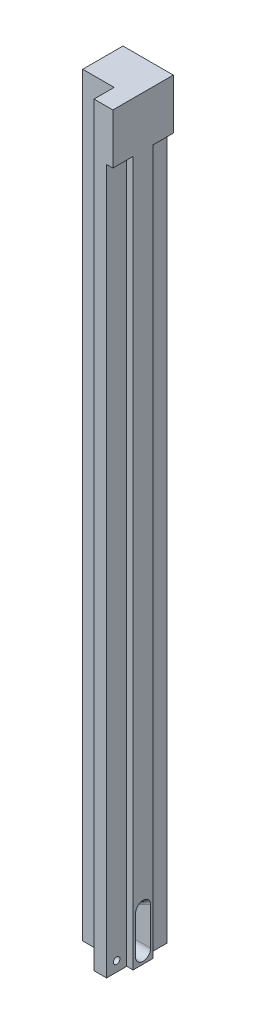
ISO-10303-21;
HEADER;
FILE_DESCRIPTION(('STEP AP214'),'2;1');
FILE_NAME('part.step','',(''),(''),'','','');
FILE_SCHEMA(('AUTOMOTIVE_DESIGN { 1 0 10303 214 1 1 1 1 }'));
ENDSEC;
DATA;
#1=APPLICATION_CONTEXT('core data for automotive mechanical design processes');
#2=APPLICATION_PROTOCOL_DEFINITION('international standard','automotive_design',2000,#1);
#3=PRODUCT_CONTEXT('',#1,'mechanical');
#4=PRODUCT('Part','Part','',(#3));
#5=PRODUCT_RELATED_PRODUCT_CATEGORY('part','',(#4));
#6=PRODUCT_DEFINITION_FORMATION('','',#4);
#7=PRODUCT_DEFINITION_CONTEXT('part definition',#1,'design');
#8=PRODUCT_DEFINITION('design','',#6,#7);
#9=PRODUCT_DEFINITION_SHAPE('','',#8);
#10=(LENGTH_UNIT() NAMED_UNIT(*) SI_UNIT(.MILLI.,.METRE.));
#11=(NAMED_UNIT(*) PLANE_ANGLE_UNIT() SI_UNIT($,.RADIAN.));
#12=(NAMED_UNIT(*) SI_UNIT($,.STERADIAN.) SOLID_ANGLE_UNIT());
#13=UNCERTAINTY_MEASURE_WITH_UNIT(LENGTH_MEASURE(1.E-05),#10,'distance_accuracy_value','');
#14=(GEOMETRIC_REPRESENTATION_CONTEXT(3) GLOBAL_UNCERTAINTY_ASSIGNED_CONTEXT((#13)) GLOBAL_UNIT_ASSIGNED_CONTEXT((#10,
#11,#12)) REPRESENTATION_CONTEXT('',''));
#15=CARTESIAN_POINT('',(0.,0.,0.));
#16=DIRECTION('',(0.,0.,1.));
#17=DIRECTION('',(1.,0.,0.));
#18=AXIS2_PLACEMENT_3D('',#15,#16,#17);
#19=CARTESIAN_POINT('',(0.,0.,0.));
#20=DIRECTION('',(0.,0.,1.));
#21=DIRECTION('',(1.,0.,0.));
#22=AXIS2_PLACEMENT_3D('',#19,#20,#21);
#23=PLANE('',#22);
#24=DIRECTION('',(1.,0.,0.));
#25=VECTOR('',#24,1.);
#26=CARTESIAN_POINT('',(6.34999999999999,82.55,0.));
#27=LINE('',#26,#25);
#28=CARTESIAN_POINT('',(4.76250000000001,82.55,0.));
#29=VERTEX_POINT('',#28);
#30=CARTESIAN_POINT('',(6.34999999999999,82.55,0.));
#31=VERTEX_POINT('',#30);
#32=EDGE_CURVE('E256',#29,#31,#27,.T.);
#33=ORIENTED_EDGE('',*,*,#32,.T.);
#34=DIRECTION('',(0.,1.,0.));
#35=VECTOR('',#34,1.);
#36=CARTESIAN_POINT('',(6.34999999999999,95.25,0.));
#37=LINE('',#36,#35);
#38=CARTESIAN_POINT('',(6.35000000000001,-95.25,0.));
#39=VERTEX_POINT('',#38);
#40=EDGE_CURVE('E455',#39,#31,#37,.T.);
#41=ORIENTED_EDGE('',*,*,#40,.F.);
#42=DIRECTION('',(1.,0.,0.));
#43=VECTOR('',#42,1.);
#44=CARTESIAN_POINT('',(-6.34999999999999,-95.25,0.));
#45=LINE('',#44,#43);
#46=CARTESIAN_POINT('',(4.76250000000001,-95.25,0.));
#47=VERTEX_POINT('',#46);
#48=EDGE_CURVE('E443',#47,#39,#45,.T.);
#49=ORIENTED_EDGE('',*,*,#48,.F.);
#50=DIRECTION('',(0.,-1.,0.));
#51=VECTOR('',#50,1.);
#52=CARTESIAN_POINT('',(4.76250000000001,95.25,0.));
#53=LINE('',#52,#51);
#54=EDGE_CURVE('E270',#29,#47,#53,.T.);
#55=ORIENTED_EDGE('',*,*,#54,.F.);
#56=EDGE_LOOP('',(#33,#41,#49,#55));
#57=FACE_BOUND('',#56,.T.);
#58=ADVANCED_FACE('F90',(#57),#23,.F.);
#59=CARTESIAN_POINT('',(4.76250000000001,95.25,0.));
#60=DIRECTION('',(1.,0.,0.));
#61=DIRECTION('',(0.,0.,-1.));
#62=AXIS2_PLACEMENT_3D('',#59,#60,#61);
#63=PLANE('',#62);
#64=DIRECTION('',(0.,-1.,0.));
#65=VECTOR('',#64,1.);
#66=CARTESIAN_POINT('',(4.76250000000001,95.25,-5.08));
#67=LINE('',#66,#65);
#68=CARTESIAN_POINT('',(4.76250000000001,82.55,-5.08));
#69=VERTEX_POINT('',#68);
#70=CARTESIAN_POINT('',(4.76250000000001,-95.25,-5.08));
#71=VERTEX_POINT('',#70);
#72=EDGE_CURVE('E276',#69,#71,#67,.T.);
#73=ORIENTED_EDGE('',*,*,#72,.F.);
#74=DIRECTION('',(0.,0.,1.));
#75=VECTOR('',#74,1.);
#76=CARTESIAN_POINT('',(4.76250000000001,82.55,0.));
#77=LINE('',#76,#75);
#78=EDGE_CURVE('E252',#69,#29,#77,.T.);
#79=ORIENTED_EDGE('',*,*,#78,.T.);
#80=ORIENTED_EDGE('',*,*,#54,.T.);
#81=DIRECTION('',(0.,0.,1.));
#82=VECTOR('',#81,1.);
#83=CARTESIAN_POINT('',(4.76250000000001,-95.25,0.));
#84=LINE('',#83,#82);
#85=EDGE_CURVE('E281',#71,#47,#84,.T.);
#86=ORIENTED_EDGE('',*,*,#85,.F.);
#87=EDGE_LOOP('',(#73,#79,#80,#86));
#88=FACE_BOUND('',#87,.T.);
#89=ADVANCED_FACE('F540',(#88),#63,.T.);
#90=CARTESIAN_POINT('',(0.,0.,5.08));
#91=DIRECTION('',(0.,0.,1.));
#92=DIRECTION('',(1.,0.,0.));
#93=AXIS2_PLACEMENT_3D('',#90,#91,#92);
#94=PLANE('',#93);
#95=DIRECTION('',(-1.,0.,0.));
#96=VECTOR('',#95,1.);
#97=CARTESIAN_POINT('',(6.34999999999999,82.55,5.08));
#98=LINE('',#97,#96);
#99=CARTESIAN_POINT('',(6.34999999999999,82.55,5.08));
#100=VERTEX_POINT('',#99);
#101=CARTESIAN_POINT('',(4.76250000000001,82.55,5.08));
#102=VERTEX_POINT('',#101);
#103=EDGE_CURVE('E240',#100,#102,#98,.T.);
#104=ORIENTED_EDGE('',*,*,#103,.T.);
#105=DIRECTION('',(0.,-1.,0.));
#106=VECTOR('',#105,1.);
#107=CARTESIAN_POINT('',(4.76250000000001,95.25,5.08));
#108=LINE('',#107,#106);
#109=CARTESIAN_POINT('',(4.76250000000001,-95.25,5.08));
#110=VERTEX_POINT('',#109);
#111=EDGE_CURVE('E294',#102,#110,#108,.T.);
#112=ORIENTED_EDGE('',*,*,#111,.T.);
#113=DIRECTION('',(1.,0.,0.));
#114=VECTOR('',#113,1.);
#115=CARTESIAN_POINT('',(-6.34999999999999,-95.25,5.08));
#116=LINE('',#115,#114);
#117=CARTESIAN_POINT('',(6.35000000000001,-95.25,5.08));
#118=VERTEX_POINT('',#117);
#119=EDGE_CURVE('E449',#110,#118,#116,.T.);
#120=ORIENTED_EDGE('',*,*,#119,.T.);
#121=DIRECTION('',(0.,1.,0.));
#122=VECTOR('',#121,1.);
#123=CARTESIAN_POINT('',(6.34999999999999,95.25,5.08));
#124=LINE('',#123,#122);
#125=EDGE_CURVE('E110',#118,#100,#124,.T.);
#126=ORIENTED_EDGE('',*,*,#125,.T.);
#127=EDGE_LOOP('',(#104,#112,#120,#126));
#128=FACE_BOUND('',#127,.T.);
#129=ADVANCED_FACE('F535',(#128),#94,.T.);
#130=CARTESIAN_POINT('',(6.34999999999999,95.25,5.08));
#131=DIRECTION('',(-1.,0.,0.));
#132=DIRECTION('',(0.,-1.,0.));
#133=AXIS2_PLACEMENT_3D('',#130,#131,#132);
#134=PLANE('',#133);
#135=DIRECTION('',(0.,1.,0.));
#136=VECTOR('',#135,1.);
#137=CARTESIAN_POINT('',(6.35000000000001,-92.71,0.635));
#138=LINE('',#137,#136);
#139=CARTESIAN_POINT('',(6.35000000000001,-92.71,0.635));
#140=VERTEX_POINT('',#139);
#141=CARTESIAN_POINT('',(6.35000000000001,-83.185,0.635));
#142=VERTEX_POINT('',#141);
#143=EDGE_CURVE('E329',#140,#142,#138,.T.);
#144=ORIENTED_EDGE('',*,*,#143,.F.);
#145=CARTESIAN_POINT('',(6.35000000000001,-92.71,2.54));
#146=DIRECTION('',(1.,0.,0.));
#147=DIRECTION('',(0.,-1.,0.));
#148=AXIS2_PLACEMENT_3D('',#145,#146,#147);
#149=CIRCLE('',#148,1.905);
#150=CARTESIAN_POINT('',(6.35000000000001,-92.71,4.445));
#151=VERTEX_POINT('',#150);
#152=EDGE_CURVE('E308',#151,#140,#149,.T.);
#153=ORIENTED_EDGE('',*,*,#152,.F.);
#154=DIRECTION('',(0.,-1.,0.));
#155=VECTOR('',#154,1.);
#156=CARTESIAN_POINT('',(6.35000000000001,-92.71,4.445));
#157=LINE('',#156,#155);
#158=CARTESIAN_POINT('',(6.35000000000001,-83.185,4.445));
#159=VERTEX_POINT('',#158);
#160=EDGE_CURVE('E416',#159,#151,#157,.T.);
#161=ORIENTED_EDGE('',*,*,#160,.F.);
#162=CARTESIAN_POINT('',(6.35000000000001,-83.185,2.54));
#163=DIRECTION('',(1.,0.,0.));
#164=DIRECTION('',(0.,-1.,0.));
#165=AXIS2_PLACEMENT_3D('',#162,#163,#164);
#166=CIRCLE('',#165,1.905);
#167=EDGE_CURVE('E95',#142,#159,#166,.T.);
#168=ORIENTED_EDGE('',*,*,#167,.F.);
#169=EDGE_LOOP('',(#144,#153,#161,#168));
#170=FACE_BOUND('',#169,.T.);
#171=ORIENTED_EDGE('',*,*,#40,.T.);
#172=DIRECTION('',(0.,0.,-1.));
#173=VECTOR('',#172,1.);
#174=CARTESIAN_POINT('',(6.34999999999999,82.55,0.));
#175=LINE('',#174,#173);
#176=CARTESIAN_POINT('',(6.34999999999999,82.55,-5.08));
#177=VERTEX_POINT('',#176);
#178=EDGE_CURVE('E246',#31,#177,#175,.T.);
#179=ORIENTED_EDGE('',*,*,#178,.T.);
#180=DIRECTION('',(0.,1.,0.));
#181=VECTOR('',#180,1.);
#182=CARTESIAN_POINT('',(6.34999999999999,82.55,-5.08));
#183=LINE('',#182,#181);
#184=CARTESIAN_POINT('',(6.34999999999999,95.25,-5.08));
#185=VERTEX_POINT('',#184);
#186=EDGE_CURVE('E214',#177,#185,#183,.T.);
#187=ORIENTED_EDGE('',*,*,#186,.T.);
#188=DIRECTION('',(0.,0.,-1.));
#189=VECTOR('',#188,1.);
#190=CARTESIAN_POINT('',(6.34999999999999,95.25,5.08));
#191=LINE('',#190,#189);
#192=CARTESIAN_POINT('',(6.34999999999999,95.25,10.16));
#193=VERTEX_POINT('',#192);
#194=EDGE_CURVE('E12',#193,#185,#191,.T.);
#195=ORIENTED_EDGE('',*,*,#194,.F.);
#196=DIRECTION('',(0.,1.,0.));
#197=VECTOR('',#196,1.);
#198=CARTESIAN_POINT('',(6.34999999999999,82.55,10.16));
#199=LINE('',#198,#197);
#200=CARTESIAN_POINT('',(6.34999999999999,82.55,10.16));
#201=VERTEX_POINT('',#200);
#202=EDGE_CURVE('E211',#201,#193,#199,.T.);
#203=ORIENTED_EDGE('',*,*,#202,.F.);
#204=DIRECTION('',(0.,0.,-1.));
#205=VECTOR('',#204,1.);
#206=CARTESIAN_POINT('',(6.34999999999999,82.55,5.08));
#207=LINE('',#206,#205);
#208=EDGE_CURVE('E243',#201,#100,#207,.T.);
#209=ORIENTED_EDGE('',*,*,#208,.T.);
#210=ORIENTED_EDGE('',*,*,#125,.F.);
#211=DIRECTION('',(0.,0.,-1.));
#212=VECTOR('',#211,1.);
#213=CARTESIAN_POINT('',(6.35000000000001,-95.25,5.08));
#214=LINE('',#213,#212);
#215=EDGE_CURVE('E454',#118,#39,#214,.T.);
#216=ORIENTED_EDGE('',*,*,#215,.T.);
#217=EDGE_LOOP('',(#171,#179,#187,#195,#203,#209,#210,#216));
#218=FACE_BOUND('',#217,.T.);
#219=ADVANCED_FACE('F92',(#170,#218),#134,.F.);
#220=CARTESIAN_POINT('',(-6.35000000000001,95.25,5.08));
#221=DIRECTION('',(0.,-1.,0.));
#222=DIRECTION('',(0.,0.,-1.));
#223=AXIS2_PLACEMENT_3D('',#220,#221,#222);
#224=PLANE('',#223);
#225=ORIENTED_EDGE('',*,*,#194,.T.);
#226=DIRECTION('',(1.,0.,0.));
#227=VECTOR('',#226,1.);
#228=CARTESIAN_POINT('',(-6.34999999999999,95.25,-5.08));
#229=LINE('',#228,#227);
#230=CARTESIAN_POINT('',(-6.34999999999999,95.25,-5.08));
#231=VERTEX_POINT('',#230);
#232=EDGE_CURVE('E275',#231,#185,#229,.T.);
#233=ORIENTED_EDGE('',*,*,#232,.F.);
#234=DIRECTION('',(0.,0.,-1.));
#235=VECTOR('',#234,1.);
#236=CARTESIAN_POINT('',(-6.35000000000001,95.25,5.08));
#237=LINE('',#236,#235);
#238=CARTESIAN_POINT('',(-6.35000000000001,95.25,5.08));
#239=VERTEX_POINT('',#238);
#240=EDGE_CURVE('E102',#239,#231,#237,.T.);
#241=ORIENTED_EDGE('',*,*,#240,.F.);
#242=DIRECTION('',(-1.,0.,0.));
#243=VECTOR('',#242,1.);
#244=CARTESIAN_POINT('',(-6.35000000000001,95.25,5.08));
#245=LINE('',#244,#243);
#246=CARTESIAN_POINT('',(1.58750000000001,95.25,5.08));
#247=VERTEX_POINT('',#246);
#248=EDGE_CURVE('E442',#247,#239,#245,.T.);
#249=ORIENTED_EDGE('',*,*,#248,.F.);
#250=DIRECTION('',(0.,0.,-1.));
#251=VECTOR('',#250,1.);
#252=CARTESIAN_POINT('',(1.58750000000001,95.25,10.16));
#253=LINE('',#252,#251);
#254=CARTESIAN_POINT('',(1.58750000000001,95.25,10.16));
#255=VERTEX_POINT('',#254);
#256=EDGE_CURVE('E223',#255,#247,#253,.T.);
#257=ORIENTED_EDGE('',*,*,#256,.F.);
#258=DIRECTION('',(-1.,0.,0.));
#259=VECTOR('',#258,1.);
#260=CARTESIAN_POINT('',(4.76250000000001,95.25,10.16));
#261=LINE('',#260,#259);
#262=EDGE_CURVE('E220',#193,#255,#261,.T.);
#263=ORIENTED_EDGE('',*,*,#262,.F.);
#264=EDGE_LOOP('',(#225,#233,#241,#249,#257,#263));
#265=FACE_BOUND('',#264,.T.);
#266=ADVANCED_FACE('F221',(#265),#224,.F.);
#267=CARTESIAN_POINT('',(-6.35000000000001,95.25,5.08));
#268=DIRECTION('',(1.,0.,0.));
#269=DIRECTION('',(0.,1.,0.));
#270=AXIS2_PLACEMENT_3D('',#267,#268,#269);
#271=PLANE('',#270);
#272=DIRECTION('',(0.,0.,-1.));
#273=VECTOR('',#272,1.);
#274=CARTESIAN_POINT('',(-6.34999999999999,-89.535,0.635));
#275=LINE('',#274,#273);
#276=CARTESIAN_POINT('',(-6.34999999999999,-89.535,4.445));
#277=VERTEX_POINT('',#276);
#278=CARTESIAN_POINT('',(-6.34999999999999,-89.535,0.635));
#279=VERTEX_POINT('',#278);
#280=EDGE_CURVE('E400',#277,#279,#275,.T.);
#281=ORIENTED_EDGE('',*,*,#280,.F.);
#282=DIRECTION('',(0.,1.,0.));
#283=VECTOR('',#282,1.);
#284=CARTESIAN_POINT('',(-6.34999999999999,-92.71,4.445));
#285=LINE('',#284,#283);
#286=CARTESIAN_POINT('',(-6.34999999999999,-92.7100000000009,4.445));
#287=VERTEX_POINT('',#286);
#288=EDGE_CURVE('E387',#287,#277,#285,.T.);
#289=ORIENTED_EDGE('',*,*,#288,.F.);
#290=CARTESIAN_POINT('',(-6.34999999999999,-92.71,2.54));
#291=DIRECTION('',(-1.,0.,0.));
#292=DIRECTION('',(0.,-1.,0.));
#293=AXIS2_PLACEMENT_3D('',#290,#291,#292);
#294=CIRCLE('',#293,1.905);
#295=CARTESIAN_POINT('',(-6.34999999999999,-92.71,0.635));
#296=VERTEX_POINT('',#295);
#297=EDGE_CURVE('E321',#296,#287,#294,.T.);
#298=ORIENTED_EDGE('',*,*,#297,.F.);
#299=DIRECTION('',(0.,-1.,0.));
#300=VECTOR('',#299,1.);
#301=CARTESIAN_POINT('',(-6.34999999999999,-92.71,0.635));
#302=LINE('',#301,#300);
#303=EDGE_CURVE('E458',#279,#296,#302,.T.);
#304=ORIENTED_EDGE('',*,*,#303,.F.);
#305=EDGE_LOOP('',(#281,#289,#298,#304));
#306=FACE_BOUND('',#305,.T.);
#307=ORIENTED_EDGE('',*,*,#240,.T.);
#308=DIRECTION('',(0.,-1.,0.));
#309=VECTOR('',#308,1.);
#310=CARTESIAN_POINT('',(-6.34999999999999,95.25,-5.08));
#311=LINE('',#310,#309);
#312=CARTESIAN_POINT('',(-6.34999999999999,-95.25,-5.08));
#313=VERTEX_POINT('',#312);
#314=EDGE_CURVE('E271',#231,#313,#311,.T.);
#315=ORIENTED_EDGE('',*,*,#314,.T.);
#316=DIRECTION('',(0.,0.,-1.));
#317=VECTOR('',#316,1.);
#318=CARTESIAN_POINT('',(-6.34999999999999,-95.25,5.08));
#319=LINE('',#318,#317);
#320=CARTESIAN_POINT('',(-6.34999999999999,-95.25,5.08));
#321=VERTEX_POINT('',#320);
#322=EDGE_CURVE('E464',#321,#313,#319,.T.);
#323=ORIENTED_EDGE('',*,*,#322,.F.);
#324=DIRECTION('',(0.,-1.,0.));
#325=VECTOR('',#324,1.);
#326=CARTESIAN_POINT('',(-6.35000000000001,95.25,5.08));
#327=LINE('',#326,#325);
#328=EDGE_CURVE('E446',#239,#321,#327,.T.);
#329=ORIENTED_EDGE('',*,*,#328,.F.);
#330=EDGE_LOOP('',(#307,#315,#323,#329));
#331=FACE_BOUND('',#330,.T.);
#332=ADVANCED_FACE('F478',(#306,#331),#271,.F.);
#333=CARTESIAN_POINT('',(-6.34999999999999,-95.25,5.08));
#334=DIRECTION('',(0.,1.,0.));
#335=DIRECTION('',(0.,0.,1.));
#336=AXIS2_PLACEMENT_3D('',#333,#334,#335);
#337=PLANE('',#336);
#338=ORIENTED_EDGE('',*,*,#322,.T.);
#339=DIRECTION('',(1.,0.,0.));
#340=VECTOR('',#339,1.);
#341=CARTESIAN_POINT('',(-6.34999999999999,-95.25,-5.08));
#342=LINE('',#341,#340);
#343=EDGE_CURVE('E285',#313,#71,#342,.T.);
#344=ORIENTED_EDGE('',*,*,#343,.T.);
#345=ORIENTED_EDGE('',*,*,#85,.T.);
#346=ORIENTED_EDGE('',*,*,#48,.T.);
#347=ORIENTED_EDGE('',*,*,#215,.F.);
#348=ORIENTED_EDGE('',*,*,#119,.F.);
#349=DIRECTION('',(0.,0.,1.));
#350=VECTOR('',#349,1.);
#351=CARTESIAN_POINT('',(4.76250000000001,-95.25,5.08));
#352=LINE('',#351,#350);
#353=CARTESIAN_POINT('',(4.76250000000001,-95.25,10.16));
#354=VERTEX_POINT('',#353);
#355=EDGE_CURVE('E289',#110,#354,#352,.T.);
#356=ORIENTED_EDGE('',*,*,#355,.T.);
#357=DIRECTION('',(-1.,0.,0.));
#358=VECTOR('',#357,1.);
#359=CARTESIAN_POINT('',(4.76250000000001,-95.25,10.16));
#360=LINE('',#359,#358);
#361=CARTESIAN_POINT('',(1.58750000000001,-95.25,10.16));
#362=VERTEX_POINT('',#361);
#363=EDGE_CURVE('E298',#354,#362,#360,.T.);
#364=ORIENTED_EDGE('',*,*,#363,.T.);
#365=DIRECTION('',(0.,0.,-1.));
#366=VECTOR('',#365,1.);
#367=CARTESIAN_POINT('',(1.58750000000001,-95.25,10.16));
#368=LINE('',#367,#366);
#369=CARTESIAN_POINT('',(1.58750000000001,-95.25,5.08));
#370=VERTEX_POINT('',#369);
#371=EDGE_CURVE('E226',#362,#370,#368,.T.);
#372=ORIENTED_EDGE('',*,*,#371,.T.);
#373=EDGE_CURVE('E450',#321,#370,#116,.T.);
#374=ORIENTED_EDGE('',*,*,#373,.F.);
#375=EDGE_LOOP('',(#338,#344,#345,#346,#347,#348,#356,#364,#372,#374));
#376=FACE_BOUND('',#375,.T.);
#377=ADVANCED_FACE('F487',(#376),#337,.F.);
#378=DIRECTION('',(0.,-1.,0.));
#379=VECTOR('',#378,1.);
#380=CARTESIAN_POINT('',(1.58750000000001,95.25,5.08));
#381=LINE('',#380,#379);
#382=EDGE_CURVE('E305',#247,#370,#381,.T.);
#383=ORIENTED_EDGE('',*,*,#382,.F.);
#384=ORIENTED_EDGE('',*,*,#248,.T.);
#385=ORIENTED_EDGE('',*,*,#328,.T.);
#386=ORIENTED_EDGE('',*,*,#373,.T.);
#387=EDGE_LOOP('',(#383,#384,#385,#386));
#388=FACE_BOUND('',#387,.T.);
#389=ADVANCED_FACE('F354',(#388),#94,.T.);
#390=CARTESIAN_POINT('',(6.35000000000001,-92.71,0.635));
#391=CARTESIAN_POINT('',(-6.34999999999999,-92.71,0.635));
#392=CARTESIAN_POINT('',(6.35000000000001,-92.8806270473334,0.635));
#393=CARTESIAN_POINT('',(-6.34999999999999,-92.8107688698681,0.634999999999999));
#394=CARTESIAN_POINT('',(6.35,-93.1902955380821,0.679451635354503));
#395=CARTESIAN_POINT('',(-6.34999999999999,-93.0184819780015,0.651003269501953));
#396=CARTESIAN_POINT('',(6.35000000000002,-93.5804268308923,0.829875615317204));
#397=CARTESIAN_POINT('',(-6.34999999999999,-93.3392190212429,0.731183474658535));
#398=CARTESIAN_POINT('',(6.35,-93.9040171129109,1.04004217740836));
#399=CARTESIAN_POINT('',(-6.34999999999999,-93.6597647213755,0.875704473116551));
#400=CARTESIAN_POINT('',(6.35000000000002,-94.2525327359207,1.37863884174124));
#401=CARTESIAN_POINT('',(-6.34999999999999,-94.064204291455,1.15901953545153));
#402=CARTESIAN_POINT('',(6.35,-94.539016945261,1.88068224599512));
#403=CARTESIAN_POINT('',(-6.34999999999999,-94.4841519989623,1.69213787158278));
#404=CARTESIAN_POINT('',(6.35000000000001,-94.6529931815687,2.54000000000004));
#405=CARTESIAN_POINT('',(-6.34999999999999,-94.6809124764192,2.53999999999998));
#406=CARTESIAN_POINT('',(6.35000000000001,-94.5390169452608,3.19931775400496));
#407=CARTESIAN_POINT('',(-6.34999999999999,-94.4841519989625,3.38786212841721));
#408=CARTESIAN_POINT('',(6.35000000000001,-94.2525327359208,3.70136115825881));
#409=CARTESIAN_POINT('',(-6.34999999999998,-94.064204291455,3.92098046454845));
#410=CARTESIAN_POINT('',(6.35000000000002,-93.9040171129111,4.03995782259168));
#411=CARTESIAN_POINT('',(-6.34999999999999,-93.6597647213754,4.20429552688344));
#412=CARTESIAN_POINT('',(6.35,-93.5804268308919,4.2501243846828));
#413=CARTESIAN_POINT('',(-6.34999999999999,-93.3392190212429,4.34881652534147));
#414=CARTESIAN_POINT('',(6.35000000000001,-93.1902955380824,4.4005483646455));
#415=CARTESIAN_POINT('',(-6.34999999999999,-93.0184819780015,4.42899673049805));
#416=CARTESIAN_POINT('',(6.35000000000001,-92.8806270473334,4.445));
#417=CARTESIAN_POINT('',(-6.34999999999999,-92.8107688698681,4.445));
#418=CARTESIAN_POINT('',(6.35000000000001,-92.1000303610225,4.445));
#419=CARTESIAN_POINT('',(-6.34999999999999,-92.3497643155982,4.445));
#420=CARTESIAN_POINT('',(6.35,-90.7291035223829,4.445));
#421=CARTESIAN_POINT('',(-6.34999999999998,-91.828550912479,4.445));
#422=CARTESIAN_POINT('',(6.35000000000002,-87.9475000000003,4.445));
#423=CARTESIAN_POINT('',(-6.35000000000001,-91.1224999999999,4.445));
#424=CARTESIAN_POINT('',(6.35,-85.1658964776166,4.445));
#425=CARTESIAN_POINT('',(-6.34999999999999,-90.4164490875213,4.445));
#426=CARTESIAN_POINT('',(6.35000000000001,-83.7949696389775,4.445));
#427=CARTESIAN_POINT('',(-6.34999999999999,-89.8952356844019,4.445));
#428=CARTESIAN_POINT('',(6.35000000000001,-83.185,4.445));
#429=CARTESIAN_POINT('',(-6.34999999999999,-89.535,4.445));
#430=B_SPLINE_SURFACE_WITH_KNOTS('',3,1,((#390,#391),(#392,#393),(#394,#395),(#396,#397),(#398,
#399),(#400,#401),(#402,#403),(#404,#405),(#406,#407),(#408,#409),(#410,#411),(#412,#413),(#414,
#415),(#416,#417),(#418,#419),(#420,#421),(#422,#423),(#424,#425),(#426,#427),(#428,#429)),
.UNSPECIFIED.,.F.,.F.,.F.,(4,1,1,1,1,1,1,1,1,1,1,1,2,1,1,1,4),(2,2),(0.,0.033003863632799,
0.066007727265598,0.099011590898397,0.132015454531196,0.198023181796794,0.264030909062392,
0.33003863632799,0.396046363593588,0.429050227226387,0.462054090859186,0.495057954491985,
0.528061818124784,0.646046363593588,0.764030909062392,0.882015454531196,1.),(0.,1.),.UNSPECIFIED.);
#431=DIRECTION('',(1.,0.,0.));
#432=VECTOR('',#431,1.);
#433=CARTESIAN_POINT('',(0.,-92.71,0.635));
#434=LINE('',#433,#432);
#435=EDGE_CURVE('E325',#296,#140,#434,.T.);
#436=DIRECTION('',(-0.894427190999916,-0.447213595499958,0.));
#437=VECTOR('',#436,1.);
#438=CARTESIAN_POINT('',(0.,-86.36,4.445));
#439=LINE('',#438,#437);
#440=EDGE_CURVE('E322',#159,#277,#439,.T.);
#441=ORIENTED_EDGE('',*,*,#152,.T.);
#442=ORIENTED_EDGE('',*,*,#435,.F.);
#443=ORIENTED_EDGE('',*,*,#297,.T.);
#444=ORIENTED_EDGE('',*,*,#288,.T.);
#445=ORIENTED_EDGE('',*,*,#440,.F.);
#446=ORIENTED_EDGE('',*,*,#160,.T.);
#447=EDGE_LOOP('',(#441,#442,#443,#444,#445,#446));
#448=FACE_BOUND('',#447,.T.);
#449=ADVANCED_FACE('F341',(#448),#430,.F.);
#450=CARTESIAN_POINT('',(6.35000000000001,-83.185,4.445));
#451=CARTESIAN_POINT('',(-6.34999999999999,-89.535,4.445));
#452=CARTESIAN_POINT('',(6.35000000000001,-82.9221504765241,4.445));
#453=CARTESIAN_POINT('',(-6.34999999999999,-89.535,4.28625));
#454=CARTESIAN_POINT('',(6.35000000000001,-82.4211759530483,4.33990030811401));
#455=CARTESIAN_POINT('',(-6.34999999999999,-89.535,3.96875));
#456=CARTESIAN_POINT('',(6.35000000000001,-81.8053695243517,3.91672303375679));
#457=CARTESIAN_POINT('',(-6.35,-89.5350000000001,3.4925));
#458=CARTESIAN_POINT('',(6.35000000000001,-81.386700238262,3.30940944578287));
#459=CARTESIAN_POINT('',(-6.34999999999999,-89.5350000000001,3.01625));
#460=CARTESIAN_POINT('',(6.35000000000001,-81.226649880869,2.54));
#461=CARTESIAN_POINT('',(-6.34999999999999,-89.535,2.54));
#462=CARTESIAN_POINT('',(6.35,-81.3867002382621,1.77059055421713));
#463=CARTESIAN_POINT('',(-6.34999999999999,-89.535,2.06375));
#464=CARTESIAN_POINT('',(6.35000000000001,-81.8053695243517,1.1632769662432));
#465=CARTESIAN_POINT('',(-6.35,-89.535,1.5875));
#466=CARTESIAN_POINT('',(6.35,-82.4211759530483,0.740099691885999));
#467=CARTESIAN_POINT('',(-6.34999999999999,-89.535,1.11125));
#468=CARTESIAN_POINT('',(6.35000000000001,-82.9221504765241,0.635));
#469=CARTESIAN_POINT('',(-6.34999999999999,-89.535,0.79375));
#470=CARTESIAN_POINT('',(6.35000000000001,-83.185,0.635));
#471=CARTESIAN_POINT('',(-6.34999999999999,-89.535,0.635));
#472=B_SPLINE_SURFACE_WITH_KNOTS('',3,1,((#450,#451),(#452,#453),(#454,#455),(#456,#457),(#458,
#459),(#460,#461),(#462,#463),(#464,#465),(#466,#467),(#468,#469),(#470,#471)),.UNSPECIFIED.,
.F.,.F.,.F.,(4,1,1,1,1,1,1,1,4),(2,2),(0.,0.125,0.25,0.375,0.5,0.625,0.75,0.875,1.),(0.,1.),.UNSPECIFIED.);
#473=DIRECTION('',(-0.894427190999916,-0.447213595499958,0.));
#474=VECTOR('',#473,1.);
#475=CARTESIAN_POINT('',(0.,-86.36,0.635));
#476=LINE('',#475,#474);
#477=EDGE_CURVE('E317',#142,#279,#476,.T.);
#478=ORIENTED_EDGE('',*,*,#167,.T.);
#479=ORIENTED_EDGE('',*,*,#440,.T.);
#480=ORIENTED_EDGE('',*,*,#280,.T.);
#481=ORIENTED_EDGE('',*,*,#477,.F.);
#482=EDGE_LOOP('',(#478,#479,#480,#481));
#483=FACE_BOUND('',#482,.T.);
#484=ADVANCED_FACE('F353',(#483),#472,.F.);
#485=CARTESIAN_POINT('',(6.35000000000001,-83.185,0.635));
#486=DIRECTION('',(0.,0.,-1.));
#487=DIRECTION('',(0.,-1.,0.));
#488=AXIS2_PLACEMENT_3D('',#485,#486,#487);
#489=PLANE('',#488);
#490=ORIENTED_EDGE('',*,*,#143,.T.);
#491=ORIENTED_EDGE('',*,*,#477,.T.);
#492=ORIENTED_EDGE('',*,*,#303,.T.);
#493=ORIENTED_EDGE('',*,*,#435,.T.);
#494=EDGE_LOOP('',(#490,#491,#492,#493));
#495=FACE_BOUND('',#494,.T.);
#496=ADVANCED_FACE('F507',(#495),#489,.F.);
#497=CARTESIAN_POINT('',(1.58750000000001,95.25,10.16));
#498=DIRECTION('',(-1.,0.,0.));
#499=DIRECTION('',(0.,0.,1.));
#500=AXIS2_PLACEMENT_3D('',#497,#498,#499);
#501=PLANE('',#500);
#502=CARTESIAN_POINT('',(1.58750000000001,-92.71,7.62));
#503=DIRECTION('',(-1.,0.,0.));
#504=DIRECTION('',(0.,0.,1.));
#505=AXIS2_PLACEMENT_3D('',#502,#503,#504);
#506=CIRCLE('',#505,0.825499999999998);
#507=CARTESIAN_POINT('',(1.58750000000001,-92.71,6.7945));
#508=VERTEX_POINT('',#507);
#509=EDGE_CURVE('E266',#508,#508,#506,.T.);
#510=ORIENTED_EDGE('',*,*,#509,.F.);
#511=EDGE_LOOP('',(#510));
#512=FACE_BOUND('',#511,.T.);
#513=ORIENTED_EDGE('',*,*,#371,.F.);
#514=DIRECTION('',(0.,-1.,0.));
#515=VECTOR('',#514,1.);
#516=CARTESIAN_POINT('',(1.58750000000001,95.25,10.16));
#517=LINE('',#516,#515);
#518=EDGE_CURVE('E309',#255,#362,#517,.T.);
#519=ORIENTED_EDGE('',*,*,#518,.F.);
#520=ORIENTED_EDGE('',*,*,#256,.T.);
#521=ORIENTED_EDGE('',*,*,#382,.T.);
#522=EDGE_LOOP('',(#513,#519,#520,#521));
#523=FACE_BOUND('',#522,.T.);
#524=ADVANCED_FACE('F552',(#512,#523),#501,.T.);
#525=CARTESIAN_POINT('',(4.76250000000001,95.25,10.16));
#526=DIRECTION('',(0.,0.,1.));
#527=DIRECTION('',(1.,0.,0.));
#528=AXIS2_PLACEMENT_3D('',#525,#526,#527);
#529=PLANE('',#528);
#530=ORIENTED_EDGE('',*,*,#363,.F.);
#531=DIRECTION('',(0.,-1.,0.));
#532=VECTOR('',#531,1.);
#533=CARTESIAN_POINT('',(4.76250000000001,95.25,10.16));
#534=LINE('',#533,#532);
#535=CARTESIAN_POINT('',(4.76250000000001,82.55,10.16));
#536=VERTEX_POINT('',#535);
#537=EDGE_CURVE('E312',#536,#354,#534,.T.);
#538=ORIENTED_EDGE('',*,*,#537,.F.);
#539=DIRECTION('',(1.,0.,0.));
#540=VECTOR('',#539,1.);
#541=CARTESIAN_POINT('',(6.34999999999999,82.55,10.16));
#542=LINE('',#541,#540);
#543=EDGE_CURVE('E232',#536,#201,#542,.T.);
#544=ORIENTED_EDGE('',*,*,#543,.T.);
#545=ORIENTED_EDGE('',*,*,#202,.T.);
#546=ORIENTED_EDGE('',*,*,#262,.T.);
#547=ORIENTED_EDGE('',*,*,#518,.T.);
#548=EDGE_LOOP('',(#530,#538,#544,#545,#546,#547));
#549=FACE_BOUND('',#548,.T.);
#550=ADVANCED_FACE('F230',(#549),#529,.T.);
#551=CARTESIAN_POINT('',(4.76250000000001,95.25,5.08));
#552=DIRECTION('',(1.,0.,0.));
#553=DIRECTION('',(0.,0.,-1.));
#554=AXIS2_PLACEMENT_3D('',#551,#552,#553);
#555=PLANE('',#554);
#556=DIRECTION('',(0.,0.,1.));
#557=VECTOR('',#556,1.);
#558=CARTESIAN_POINT('',(4.76250000000001,82.55,5.08));
#559=LINE('',#558,#557);
#560=EDGE_CURVE('E118',#102,#536,#559,.T.);
#561=ORIENTED_EDGE('',*,*,#560,.T.);
#562=ORIENTED_EDGE('',*,*,#537,.T.);
#563=ORIENTED_EDGE('',*,*,#355,.F.);
#564=ORIENTED_EDGE('',*,*,#111,.F.);
#565=EDGE_LOOP('',(#561,#562,#563,#564));
#566=FACE_BOUND('',#565,.T.);
#567=CARTESIAN_POINT('',(4.76250000000001,-92.71,7.62));
#568=DIRECTION('',(1.,0.,0.));
#569=DIRECTION('',(0.,0.,-1.));
#570=AXIS2_PLACEMENT_3D('',#567,#568,#569);
#571=CIRCLE('',#570,0.825499999999998);
#572=CARTESIAN_POINT('',(4.76250000000001,-92.71,6.7945));
#573=VERTEX_POINT('',#572);
#574=EDGE_CURVE('E262',#573,#573,#571,.T.);
#575=ORIENTED_EDGE('',*,*,#574,.F.);
#576=EDGE_LOOP('',(#575));
#577=FACE_BOUND('',#576,.T.);
#578=ADVANCED_FACE('F355',(#566,#577),#555,.T.);
#579=CARTESIAN_POINT('',(-6.34999999999999,95.25,-5.08));
#580=DIRECTION('',(0.,0.,-1.));
#581=DIRECTION('',(-1.,0.,0.));
#582=AXIS2_PLACEMENT_3D('',#579,#580,#581);
#583=PLANE('',#582);
#584=ORIENTED_EDGE('',*,*,#343,.F.);
#585=ORIENTED_EDGE('',*,*,#314,.F.);
#586=ORIENTED_EDGE('',*,*,#232,.T.);
#587=ORIENTED_EDGE('',*,*,#186,.F.);
#588=DIRECTION('',(-1.,0.,0.));
#589=VECTOR('',#588,1.);
#590=CARTESIAN_POINT('',(6.34999999999999,82.55,-5.08));
#591=LINE('',#590,#589);
#592=EDGE_CURVE('E249',#177,#69,#591,.T.);
#593=ORIENTED_EDGE('',*,*,#592,.T.);
#594=ORIENTED_EDGE('',*,*,#72,.T.);
#595=EDGE_LOOP('',(#584,#585,#586,#587,#593,#594));
#596=FACE_BOUND('',#595,.T.);
#597=ADVANCED_FACE('F606',(#596),#583,.T.);
#598=CARTESIAN_POINT('',(-6.36281791655928,-92.71,7.62));
#599=DIRECTION('',(1.,0.,0.));
#600=DIRECTION('',(0.,0.,-1.));
#601=AXIS2_PLACEMENT_3D('',#598,#599,#600);
#602=CYLINDRICAL_SURFACE('',#601,0.825499999999998);
#603=CARTESIAN_POINT('',(1.58750000000001,-92.71,6.7945));
#604=CARTESIAN_POINT('',(1.62057291666668,-92.71,6.7945));
#605=CARTESIAN_POINT('',(1.65364583333334,-92.71,6.7945));
#606=CARTESIAN_POINT('',(1.71979166666668,-92.71,6.7945));
#607=CARTESIAN_POINT('',(1.75286458333334,-92.71,6.7945));
#608=CARTESIAN_POINT('',(1.81901041666668,-92.71,6.7945));
#609=CARTESIAN_POINT('',(1.85208333333334,-92.71,6.7945));
#610=CARTESIAN_POINT('',(1.91822916666668,-92.71,6.7945));
#611=CARTESIAN_POINT('',(1.95130208333334,-92.71,6.7945));
#612=CARTESIAN_POINT('',(2.01744791666668,-92.71,6.7945));
#613=CARTESIAN_POINT('',(2.05052083333334,-92.71,6.7945));
#614=CARTESIAN_POINT('',(2.11666666666668,-92.71,6.7945));
#615=CARTESIAN_POINT('',(2.14973958333334,-92.71,6.7945));
#616=CARTESIAN_POINT('',(2.21588541666668,-92.71,6.7945));
#617=CARTESIAN_POINT('',(2.24895833333334,-92.71,6.7945));
#618=CARTESIAN_POINT('',(2.31510416666668,-92.71,6.7945));
#619=CARTESIAN_POINT('',(2.34817708333334,-92.71,6.7945));
#620=CARTESIAN_POINT('',(2.41432291666668,-92.71,6.7945));
#621=CARTESIAN_POINT('',(2.44739583333334,-92.71,6.7945));
#622=CARTESIAN_POINT('',(2.51354166666668,-92.71,6.7945));
#623=CARTESIAN_POINT('',(2.54661458333334,-92.71,6.7945));
#624=CARTESIAN_POINT('',(2.61276041666668,-92.71,6.7945));
#625=CARTESIAN_POINT('',(2.64583333333334,-92.71,6.7945));
#626=CARTESIAN_POINT('',(2.71197916666668,-92.71,6.7945));
#627=CARTESIAN_POINT('',(2.74505208333334,-92.71,6.7945));
#628=CARTESIAN_POINT('',(2.81119791666668,-92.71,6.7945));
#629=CARTESIAN_POINT('',(2.84427083333334,-92.71,6.7945));
#630=CARTESIAN_POINT('',(2.91041666666668,-92.71,6.7945));
#631=CARTESIAN_POINT('',(2.94348958333334,-92.71,6.7945));
#632=CARTESIAN_POINT('',(3.00963541666668,-92.71,6.7945));
#633=CARTESIAN_POINT('',(3.04270833333334,-92.71,6.7945));
#634=CARTESIAN_POINT('',(3.10885416666668,-92.71,6.7945));
#635=CARTESIAN_POINT('',(3.14192708333334,-92.71,6.7945));
#636=CARTESIAN_POINT('',(3.20807291666668,-92.71,6.7945));
#637=CARTESIAN_POINT('',(3.24114583333334,-92.71,6.7945));
#638=CARTESIAN_POINT('',(3.30729166666668,-92.71,6.7945));
#639=CARTESIAN_POINT('',(3.34036458333334,-92.71,6.7945));
#640=CARTESIAN_POINT('',(3.40651041666668,-92.71,6.7945));
#641=CARTESIAN_POINT('',(3.43958333333334,-92.71,6.7945));
#642=CARTESIAN_POINT('',(3.50572916666668,-92.71,6.7945));
#643=CARTESIAN_POINT('',(3.53880208333334,-92.71,6.7945));
#644=CARTESIAN_POINT('',(3.60494791666668,-92.71,6.7945));
#645=CARTESIAN_POINT('',(3.63802083333334,-92.71,6.7945));
#646=CARTESIAN_POINT('',(3.70416666666668,-92.71,6.7945));
#647=CARTESIAN_POINT('',(3.73723958333334,-92.71,6.7945));
#648=CARTESIAN_POINT('',(3.80338541666668,-92.71,6.7945));
#649=CARTESIAN_POINT('',(3.83645833333334,-92.71,6.7945));
#650=CARTESIAN_POINT('',(3.90260416666668,-92.71,6.7945));
#651=CARTESIAN_POINT('',(3.93567708333334,-92.71,6.7945));
#652=CARTESIAN_POINT('',(4.00182291666668,-92.71,6.7945));
#653=CARTESIAN_POINT('',(4.03489583333334,-92.71,6.7945));
#654=CARTESIAN_POINT('',(4.10104166666668,-92.71,6.7945));
#655=CARTESIAN_POINT('',(4.13411458333334,-92.71,6.7945));
#656=CARTESIAN_POINT('',(4.20026041666668,-92.71,6.7945));
#657=CARTESIAN_POINT('',(4.23333333333334,-92.71,6.7945));
#658=CARTESIAN_POINT('',(4.29947916666667,-92.71,6.7945));
#659=CARTESIAN_POINT('',(4.33255208333334,-92.71,6.7945));
#660=CARTESIAN_POINT('',(4.39869791666668,-92.71,6.7945));
#661=CARTESIAN_POINT('',(4.43177083333334,-92.71,6.7945));
#662=CARTESIAN_POINT('',(4.49791666666668,-92.71,6.7945));
#663=CARTESIAN_POINT('',(4.53098958333334,-92.71,6.7945));
#664=CARTESIAN_POINT('',(4.59713541666668,-92.71,6.7945));
#665=CARTESIAN_POINT('',(4.63020833333334,-92.71,6.7945));
#666=CARTESIAN_POINT('',(4.69635416666668,-92.71,6.7945));
#667=CARTESIAN_POINT('',(4.72942708333334,-92.71,6.7945));
#668=CARTESIAN_POINT('',(4.76250000000001,-92.71,6.7945));
#669=B_SPLINE_CURVE_WITH_KNOTS('',3,(#603,#604,#605,#606,#607,#608,#609,#610,#611,#612,#613,
#614,#615,#616,#617,#618,#619,#620,#621,#622,#623,#624,#625,#626,#627,#628,#629,#630,#631,#632,
#633,#634,#635,#636,#637,#638,#639,#640,#641,#642,#643,#644,#645,#646,#647,#648,#649,#650,#651,
#652,#653,#654,#655,#656,#657,#658,#659,#660,#661,#662,#663,#664,#665,#666,#667,#668),
.UNSPECIFIED.,.F.,.F.,(4,2,2,2,2,2,2,2,2,2,2,2,2,2,2,2,2,2,2,2,2,2,2,2,2,2,2,2,2,2,2,2,4),(0.,
0.0992187499999995,0.198437499999999,0.29765625,0.396875,0.496093749999999,0.5953125,0.69453125,
0.793749999999999,0.892968749999999,0.992187499999998,1.09140625,1.190625,1.28984375,1.3890625,
1.48828125,1.5875,1.68671875,1.7859375,1.88515625,1.984375,2.08359375,2.1828125,2.28203125,
2.38125,2.48046875,2.5796875,2.67890625,2.778125,2.87734375,2.9765625,3.07578125,3.175),.UNSPECIFIED.);
#670=EDGE_CURVE('BSEAM615',#508,#573,#669,.T.);
#671=ORIENTED_EDGE('',*,*,#509,.T.);
#672=ORIENTED_EDGE('',*,*,#574,.T.);
#673=ORIENTED_EDGE('',*,*,#670,.T.);
#674=ORIENTED_EDGE('',*,*,#670,.F.);
#675=EDGE_LOOP('',(#671,#673,#672,#674));
#676=FACE_BOUND('',#675,.T.);
#677=ADVANCED_FACE('F615',(#676),#602,.F.);
#678=CARTESIAN_POINT('',(0.,82.55,0.));
#679=DIRECTION('',(0.,1.,0.));
#680=DIRECTION('',(0.,0.,1.));
#681=AXIS2_PLACEMENT_3D('',#678,#679,#680);
#682=PLANE('',#681);
#683=ORIENTED_EDGE('',*,*,#178,.F.);
#684=ORIENTED_EDGE('',*,*,#32,.F.);
#685=ORIENTED_EDGE('',*,*,#78,.F.);
#686=ORIENTED_EDGE('',*,*,#592,.F.);
#687=EDGE_LOOP('',(#683,#684,#685,#686));
#688=FACE_BOUND('',#687,.T.);
#689=ADVANCED_FACE('F623',(#688),#682,.F.);
#690=CARTESIAN_POINT('',(0.,82.55,0.));
#691=DIRECTION('',(0.,-1.,0.));
#692=DIRECTION('',(0.,0.,-1.));
#693=AXIS2_PLACEMENT_3D('',#690,#691,#692);
#694=PLANE('',#693);
#695=ORIENTED_EDGE('',*,*,#208,.F.);
#696=ORIENTED_EDGE('',*,*,#543,.F.);
#697=ORIENTED_EDGE('',*,*,#560,.F.);
#698=ORIENTED_EDGE('',*,*,#103,.F.);
#699=EDGE_LOOP('',(#695,#696,#697,#698));
#700=FACE_BOUND('',#699,.T.);
#701=ADVANCED_FACE('F627',(#700),#694,.T.);
#702=CLOSED_SHELL('',(#58,#89,#129,#219,#266,#332,#377,#389,#449,#484,#496,#524,#550,#578,#597,
#677,#689,#701));
#703=MANIFOLD_SOLID_BREP('B2',#702);
#704=ADVANCED_BREP_SHAPE_REPRESENTATION('',(#18,#703),#14);
#705=SHAPE_DEFINITION_REPRESENTATION(#9,#704);
ENDSEC;
END-ISO-10303-21;
